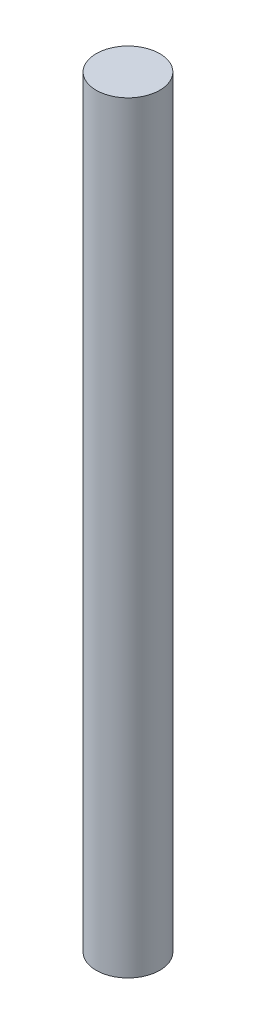
ISO-10303-21;
HEADER;
FILE_DESCRIPTION(('STEP AP214'),'2;1');
FILE_NAME('part.step','',(''),(''),'','','');
FILE_SCHEMA(('AUTOMOTIVE_DESIGN { 1 0 10303 214 1 1 1 1 }'));
ENDSEC;
DATA;
#1=APPLICATION_CONTEXT('core data for automotive mechanical design processes');
#2=APPLICATION_PROTOCOL_DEFINITION('international standard','automotive_design',2000,#1);
#3=PRODUCT_CONTEXT('',#1,'mechanical');
#4=PRODUCT('Part','Part','',(#3));
#5=PRODUCT_RELATED_PRODUCT_CATEGORY('part','',(#4));
#6=PRODUCT_DEFINITION_FORMATION('','',#4);
#7=PRODUCT_DEFINITION_CONTEXT('part definition',#1,'design');
#8=PRODUCT_DEFINITION('design','',#6,#7);
#9=PRODUCT_DEFINITION_SHAPE('','',#8);
#10=(LENGTH_UNIT() NAMED_UNIT(*) SI_UNIT(.MILLI.,.METRE.));
#11=(NAMED_UNIT(*) PLANE_ANGLE_UNIT() SI_UNIT($,.RADIAN.));
#12=(NAMED_UNIT(*) SI_UNIT($,.STERADIAN.) SOLID_ANGLE_UNIT());
#13=UNCERTAINTY_MEASURE_WITH_UNIT(LENGTH_MEASURE(1.E-05),#10,'distance_accuracy_value','');
#14=(GEOMETRIC_REPRESENTATION_CONTEXT(3) GLOBAL_UNCERTAINTY_ASSIGNED_CONTEXT((#13)) GLOBAL_UNIT_ASSIGNED_CONTEXT((#10,
#11,#12)) REPRESENTATION_CONTEXT('',''));
#15=CARTESIAN_POINT('',(0.,0.,0.));
#16=DIRECTION('',(0.,0.,1.));
#17=DIRECTION('',(1.,0.,0.));
#18=AXIS2_PLACEMENT_3D('',#15,#16,#17);
#19=CARTESIAN_POINT('',(0.,36.,0.));
#20=DIRECTION('',(0.,-1.,0.));
#21=DIRECTION('',(0.,0.,-1.));
#22=AXIS2_PLACEMENT_3D('',#19,#20,#21);
#23=CYLINDRICAL_SURFACE('',#22,1.5);
#24=CARTESIAN_POINT('',(0.,36.,0.));
#25=DIRECTION('',(0.,1.,0.));
#26=DIRECTION('',(0.,0.,1.));
#27=AXIS2_PLACEMENT_3D('',#24,#25,#26);
#28=CIRCLE('',#27,1.5);
#29=CARTESIAN_POINT('',(0.,36.,1.5));
#30=VERTEX_POINT('',#29);
#31=EDGE_CURVE('E10',#30,#30,#28,.T.);
#32=ORIENTED_EDGE('',*,*,#31,.F.);
#33=EDGE_LOOP('',(#32));
#34=FACE_BOUND('',#33,.T.);
#35=CARTESIAN_POINT('',(0.,0.,0.));
#36=DIRECTION('',(0.,1.,0.));
#37=DIRECTION('',(0.,0.,1.));
#38=AXIS2_PLACEMENT_3D('',#35,#36,#37);
#39=CIRCLE('',#38,1.5);
#40=CARTESIAN_POINT('',(0.,0.,1.5));
#41=VERTEX_POINT('',#40);
#42=EDGE_CURVE('E38',#41,#41,#39,.T.);
#43=ORIENTED_EDGE('',*,*,#42,.T.);
#44=EDGE_LOOP('',(#43));
#45=FACE_BOUND('',#44,.T.);
#46=ADVANCED_FACE('F35',(#34,#45),#23,.T.);
#47=CARTESIAN_POINT('',(0.,36.,0.));
#48=DIRECTION('',(0.,1.,0.));
#49=DIRECTION('',(0.,0.,1.));
#50=AXIS2_PLACEMENT_3D('',#47,#48,#49);
#51=PLANE('',#50);
#52=ORIENTED_EDGE('',*,*,#31,.T.);
#53=EDGE_LOOP('',(#52));
#54=FACE_BOUND('',#53,.T.);
#55=ADVANCED_FACE('F50',(#54),#51,.T.);
#56=CARTESIAN_POINT('',(0.,0.,0.));
#57=DIRECTION('',(0.,1.,0.));
#58=DIRECTION('',(0.,0.,1.));
#59=AXIS2_PLACEMENT_3D('',#56,#57,#58);
#60=PLANE('',#59);
#61=ORIENTED_EDGE('',*,*,#42,.F.);
#62=EDGE_LOOP('',(#61));
#63=FACE_BOUND('',#62,.T.);
#64=ADVANCED_FACE('F48',(#63),#60,.F.);
#65=CLOSED_SHELL('',(#46,#55,#64));
#66=MANIFOLD_SOLID_BREP('B2',#65);
#67=ADVANCED_BREP_SHAPE_REPRESENTATION('',(#18,#66),#14);
#68=SHAPE_DEFINITION_REPRESENTATION(#9,#67);
ENDSEC;
END-ISO-10303-21;
